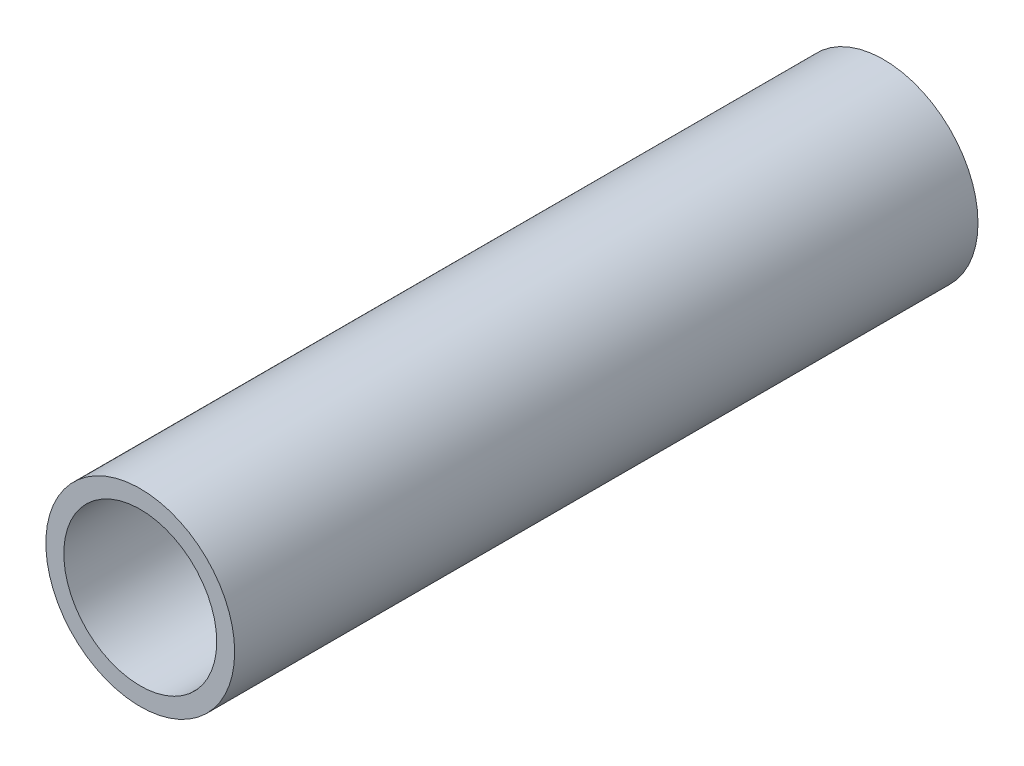
ISO-10303-21;
HEADER;
FILE_DESCRIPTION(('STEP AP214'),'2;1');
FILE_NAME('part.step','',(''),(''),'','','');
FILE_SCHEMA(('AUTOMOTIVE_DESIGN { 1 0 10303 214 1 1 1 1 }'));
ENDSEC;
DATA;
#1=APPLICATION_CONTEXT('core data for automotive mechanical design processes');
#2=APPLICATION_PROTOCOL_DEFINITION('international standard','automotive_design',2000,#1);
#3=PRODUCT_CONTEXT('',#1,'mechanical');
#4=PRODUCT('Part','Part','',(#3));
#5=PRODUCT_RELATED_PRODUCT_CATEGORY('part','',(#4));
#6=PRODUCT_DEFINITION_FORMATION('','',#4);
#7=PRODUCT_DEFINITION_CONTEXT('part definition',#1,'design');
#8=PRODUCT_DEFINITION('design','',#6,#7);
#9=PRODUCT_DEFINITION_SHAPE('','',#8);
#10=(LENGTH_UNIT() NAMED_UNIT(*) SI_UNIT(.MILLI.,.METRE.));
#11=(NAMED_UNIT(*) PLANE_ANGLE_UNIT() SI_UNIT($,.RADIAN.));
#12=(NAMED_UNIT(*) SI_UNIT($,.STERADIAN.) SOLID_ANGLE_UNIT());
#13=UNCERTAINTY_MEASURE_WITH_UNIT(LENGTH_MEASURE(1.E-05),#10,'distance_accuracy_value','');
#14=(GEOMETRIC_REPRESENTATION_CONTEXT(3) GLOBAL_UNCERTAINTY_ASSIGNED_CONTEXT((#13)) GLOBAL_UNIT_ASSIGNED_CONTEXT((#10,
#11,#12)) REPRESENTATION_CONTEXT('',''));
#15=CARTESIAN_POINT('',(0.,0.,0.));
#16=DIRECTION('',(0.,0.,1.));
#17=DIRECTION('',(1.,0.,0.));
#18=AXIS2_PLACEMENT_3D('',#15,#16,#17);
#19=CARTESIAN_POINT('',(0.,0.,100.));
#20=DIRECTION('',(0.,0.,1.));
#21=DIRECTION('',(1.,0.,0.));
#22=AXIS2_PLACEMENT_3D('',#19,#20,#21);
#23=PLANE('',#22);
#24=CARTESIAN_POINT('',(0.,0.,100.));
#25=DIRECTION('',(0.,0.,1.));
#26=DIRECTION('',(1.,0.,0.));
#27=AXIS2_PLACEMENT_3D('',#24,#25,#26);
#28=CIRCLE('',#27,12.7);
#29=CARTESIAN_POINT('',(12.7,0.,100.));
#30=VERTEX_POINT('',#29);
#31=EDGE_CURVE('E11',#30,#30,#28,.T.);
#32=ORIENTED_EDGE('',*,*,#31,.T.);
#33=EDGE_LOOP('',(#32));
#34=FACE_BOUND('',#33,.T.);
#35=CARTESIAN_POINT('',(0.,0.,100.));
#36=DIRECTION('',(0.,0.,1.));
#37=DIRECTION('',(1.,0.,0.));
#38=AXIS2_PLACEMENT_3D('',#35,#36,#37);
#39=CIRCLE('',#38,10.287);
#40=CARTESIAN_POINT('',(10.287,0.,100.));
#41=VERTEX_POINT('',#40);
#42=EDGE_CURVE('E54',#41,#41,#39,.T.);
#43=ORIENTED_EDGE('',*,*,#42,.F.);
#44=EDGE_LOOP('',(#43));
#45=FACE_BOUND('',#44,.T.);
#46=ADVANCED_FACE('F43',(#34,#45),#23,.T.);
#47=CARTESIAN_POINT('',(0.,0.,0.));
#48=DIRECTION('',(0.,0.,1.));
#49=DIRECTION('',(1.,0.,0.));
#50=AXIS2_PLACEMENT_3D('',#47,#48,#49);
#51=PLANE('',#50);
#52=CARTESIAN_POINT('',(0.,0.,0.));
#53=DIRECTION('',(0.,0.,1.));
#54=DIRECTION('',(1.,0.,0.));
#55=AXIS2_PLACEMENT_3D('',#52,#53,#54);
#56=CIRCLE('',#55,12.7);
#57=CARTESIAN_POINT('',(12.7,0.,0.));
#58=VERTEX_POINT('',#57);
#59=EDGE_CURVE('E47',#58,#58,#56,.T.);
#60=ORIENTED_EDGE('',*,*,#59,.F.);
#61=EDGE_LOOP('',(#60));
#62=FACE_BOUND('',#61,.T.);
#63=CARTESIAN_POINT('',(0.,0.,0.));
#64=DIRECTION('',(0.,0.,1.));
#65=DIRECTION('',(1.,0.,0.));
#66=AXIS2_PLACEMENT_3D('',#63,#64,#65);
#67=CIRCLE('',#66,10.287);
#68=CARTESIAN_POINT('',(10.287,0.,0.));
#69=VERTEX_POINT('',#68);
#70=EDGE_CURVE('E57',#69,#69,#67,.T.);
#71=ORIENTED_EDGE('',*,*,#70,.T.);
#72=EDGE_LOOP('',(#71));
#73=FACE_BOUND('',#72,.T.);
#74=ADVANCED_FACE('F67',(#62,#73),#51,.F.);
#75=CARTESIAN_POINT('',(0.,0.,100.));
#76=DIRECTION('',(0.,0.,-1.));
#77=DIRECTION('',(-1.,0.,0.));
#78=AXIS2_PLACEMENT_3D('',#75,#76,#77);
#79=CYLINDRICAL_SURFACE('',#78,12.7);
#80=ORIENTED_EDGE('',*,*,#31,.F.);
#81=EDGE_LOOP('',(#80));
#82=FACE_BOUND('',#81,.T.);
#83=ORIENTED_EDGE('',*,*,#59,.T.);
#84=EDGE_LOOP('',(#83));
#85=FACE_BOUND('',#84,.T.);
#86=ADVANCED_FACE('F45',(#82,#85),#79,.T.);
#87=CARTESIAN_POINT('',(0.,0.,100.));
#88=DIRECTION('',(0.,0.,-1.));
#89=DIRECTION('',(-1.,0.,0.));
#90=AXIS2_PLACEMENT_3D('',#87,#88,#89);
#91=CYLINDRICAL_SURFACE('',#90,10.287);
#92=ORIENTED_EDGE('',*,*,#42,.T.);
#93=EDGE_LOOP('',(#92));
#94=FACE_BOUND('',#93,.T.);
#95=ORIENTED_EDGE('',*,*,#70,.F.);
#96=EDGE_LOOP('',(#95));
#97=FACE_BOUND('',#96,.T.);
#98=ADVANCED_FACE('F63',(#94,#97),#91,.F.);
#99=CLOSED_SHELL('',(#46,#74,#86,#98));
#100=MANIFOLD_SOLID_BREP('B2',#99);
#101=ADVANCED_BREP_SHAPE_REPRESENTATION('',(#18,#100),#14);
#102=SHAPE_DEFINITION_REPRESENTATION(#9,#101);
ENDSEC;
END-ISO-10303-21;
